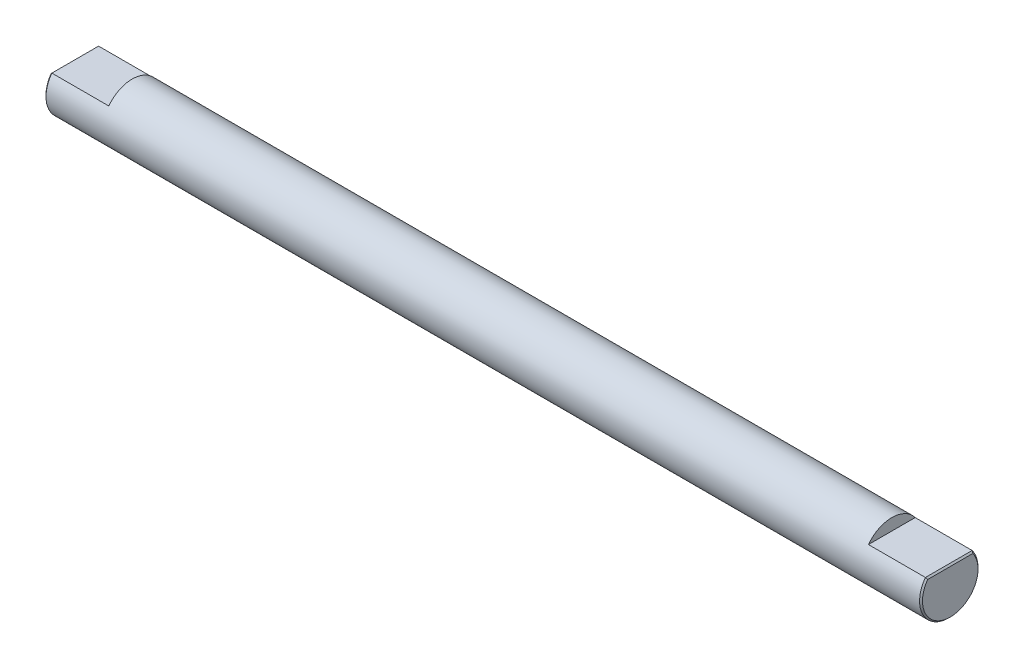
ISO-10303-21;
HEADER;
FILE_DESCRIPTION(('STEP AP214'),'2;1');
FILE_NAME('part.step','',(''),(''),'','','');
FILE_SCHEMA(('AUTOMOTIVE_DESIGN { 1 0 10303 214 1 1 1 1 }'));
ENDSEC;
DATA;
#1=APPLICATION_CONTEXT('core data for automotive mechanical design processes');
#2=APPLICATION_PROTOCOL_DEFINITION('international standard','automotive_design',2000,#1);
#3=PRODUCT_CONTEXT('',#1,'mechanical');
#4=PRODUCT('Part','Part','',(#3));
#5=PRODUCT_RELATED_PRODUCT_CATEGORY('part','',(#4));
#6=PRODUCT_DEFINITION_FORMATION('','',#4);
#7=PRODUCT_DEFINITION_CONTEXT('part definition',#1,'design');
#8=PRODUCT_DEFINITION('design','',#6,#7);
#9=PRODUCT_DEFINITION_SHAPE('','',#8);
#10=(LENGTH_UNIT() NAMED_UNIT(*) SI_UNIT(.MILLI.,.METRE.));
#11=(NAMED_UNIT(*) PLANE_ANGLE_UNIT() SI_UNIT($,.RADIAN.));
#12=(NAMED_UNIT(*) SI_UNIT($,.STERADIAN.) SOLID_ANGLE_UNIT());
#13=UNCERTAINTY_MEASURE_WITH_UNIT(LENGTH_MEASURE(1.E-05),#10,'distance_accuracy_value','');
#14=(GEOMETRIC_REPRESENTATION_CONTEXT(3) GLOBAL_UNCERTAINTY_ASSIGNED_CONTEXT((#13)) GLOBAL_UNIT_ASSIGNED_CONTEXT((#10,
#11,#12)) REPRESENTATION_CONTEXT('',''));
#15=CARTESIAN_POINT('',(0.,0.,0.));
#16=DIRECTION('',(0.,0.,1.));
#17=DIRECTION('',(1.,0.,0.));
#18=AXIS2_PLACEMENT_3D('',#15,#16,#17);
#19=CARTESIAN_POINT('',(0.,0.,0.));
#20=DIRECTION('',(1.,0.,0.));
#21=DIRECTION('',(0.,0.,-1.));
#22=AXIS2_PLACEMENT_3D('',#19,#20,#21);
#23=PLANE('',#22);
#24=CARTESIAN_POINT('',(0.,0.,0.));
#25=DIRECTION('',(1.,0.,0.));
#26=DIRECTION('',(0.,0.,-1.));
#27=AXIS2_PLACEMENT_3D('',#24,#25,#26);
#28=CIRCLE('',#27,9.50000000000001);
#29=CARTESIAN_POINT('',(0.,5.50000000000001,-7.74596669241484));
#30=VERTEX_POINT('',#29);
#31=CARTESIAN_POINT('',(0.,5.50000000000001,7.74596669241484));
#32=VERTEX_POINT('',#31);
#33=EDGE_CURVE('E116',#30,#32,#28,.F.);
#34=ORIENTED_EDGE('',*,*,#33,.T.);
#35=DIRECTION('',(0.,0.,-1.));
#36=VECTOR('',#35,1.);
#37=CARTESIAN_POINT('',(0.,5.50000000000001,0.));
#38=LINE('',#37,#36);
#39=EDGE_CURVE('E124',#32,#30,#38,.T.);
#40=ORIENTED_EDGE('',*,*,#39,.T.);
#41=EDGE_LOOP('',(#34,#40));
#42=FACE_BOUND('',#41,.T.);
#43=ADVANCED_FACE('F35',(#42),#23,.F.);
#44=CARTESIAN_POINT('',(0.,0.,0.));
#45=DIRECTION('',(-1.,0.,0.));
#46=DIRECTION('',(0.,0.,1.));
#47=AXIS2_PLACEMENT_3D('',#44,#45,#46);
#48=CYLINDRICAL_SURFACE('',#47,10.);
#49=DIRECTION('',(-1.,0.,0.));
#50=VECTOR('',#49,1.);
#51=CARTESIAN_POINT('',(0.,6.,8.));
#52=LINE('',#51,#50);
#53=CARTESIAN_POINT('',(20.,6.,7.99999999999999));
#54=VERTEX_POINT('',#53);
#55=CARTESIAN_POINT('',(0.499999999999997,6.,8.));
#56=VERTEX_POINT('',#55);
#57=EDGE_CURVE('E113',#54,#56,#52,.T.);
#58=ORIENTED_EDGE('',*,*,#57,.T.);
#59=CARTESIAN_POINT('',(0.499999999999997,0.,0.));
#60=DIRECTION('',(1.,0.,0.));
#61=DIRECTION('',(0.,0.,-1.));
#62=AXIS2_PLACEMENT_3D('',#59,#60,#61);
#63=CIRCLE('',#62,10.);
#64=CARTESIAN_POINT('',(0.499999999999997,6.,-8.));
#65=VERTEX_POINT('',#64);
#66=EDGE_CURVE('E129',#56,#65,#63,.T.);
#67=ORIENTED_EDGE('',*,*,#66,.T.);
#68=DIRECTION('',(-1.,0.,0.));
#69=VECTOR('',#68,1.);
#70=CARTESIAN_POINT('',(0.,6.,-8.));
#71=LINE('',#70,#69);
#72=CARTESIAN_POINT('',(20.,6.,-8.));
#73=VERTEX_POINT('',#72);
#74=EDGE_CURVE('E163',#65,#73,#71,.F.);
#75=ORIENTED_EDGE('',*,*,#74,.T.);
#76=CARTESIAN_POINT('',(20.,0.,0.));
#77=DIRECTION('',(1.,0.,0.));
#78=DIRECTION('',(0.,0.,-1.));
#79=AXIS2_PLACEMENT_3D('',#76,#77,#78);
#80=CIRCLE('',#79,10.);
#81=EDGE_CURVE('E119',#73,#54,#80,.T.);
#82=ORIENTED_EDGE('',*,*,#81,.T.);
#83=EDGE_LOOP('',(#58,#67,#75,#82));
#84=FACE_BOUND('',#83,.T.);
#85=DIRECTION('',(-1.,0.,0.));
#86=VECTOR('',#85,1.);
#87=CARTESIAN_POINT('',(0.,6.,-8.));
#88=LINE('',#87,#86);
#89=CARTESIAN_POINT('',(280.,6.,-8.));
#90=VERTEX_POINT('',#89);
#91=CARTESIAN_POINT('',(299.5,6.,-8.));
#92=VERTEX_POINT('',#91);
#93=EDGE_CURVE('E96',#90,#92,#88,.F.);
#94=ORIENTED_EDGE('',*,*,#93,.T.);
#95=CARTESIAN_POINT('',(299.5,0.,0.));
#96=DIRECTION('',(-1.,0.,0.));
#97=DIRECTION('',(0.,0.,1.));
#98=AXIS2_PLACEMENT_3D('',#95,#96,#97);
#99=CIRCLE('',#98,10.);
#100=CARTESIAN_POINT('',(299.5,6.,8.));
#101=VERTEX_POINT('',#100);
#102=EDGE_CURVE('E127',#92,#101,#99,.T.);
#103=ORIENTED_EDGE('',*,*,#102,.T.);
#104=DIRECTION('',(-1.,0.,0.));
#105=VECTOR('',#104,1.);
#106=CARTESIAN_POINT('',(0.,6.,8.));
#107=LINE('',#106,#105);
#108=CARTESIAN_POINT('',(280.,6.,7.99999999999999));
#109=VERTEX_POINT('',#108);
#110=EDGE_CURVE('E103',#101,#109,#107,.T.);
#111=ORIENTED_EDGE('',*,*,#110,.T.);
#112=CARTESIAN_POINT('',(280.,0.,0.));
#113=DIRECTION('',(-1.,0.,0.));
#114=DIRECTION('',(0.,0.,1.));
#115=AXIS2_PLACEMENT_3D('',#112,#113,#114);
#116=CIRCLE('',#115,10.);
#117=EDGE_CURVE('E108',#109,#90,#116,.T.);
#118=ORIENTED_EDGE('',*,*,#117,.T.);
#119=EDGE_LOOP('',(#94,#103,#111,#118));
#120=FACE_BOUND('',#119,.T.);
#121=ADVANCED_FACE('F111',(#84,#120),#48,.T.);
#122=CARTESIAN_POINT('',(300.,0.,0.));
#123=DIRECTION('',(-1.,0.,0.));
#124=DIRECTION('',(0.,0.,1.));
#125=AXIS2_PLACEMENT_3D('',#122,#123,#124);
#126=PLANE('',#125);
#127=CARTESIAN_POINT('',(300.,0.,0.));
#128=DIRECTION('',(-1.,0.,0.));
#129=DIRECTION('',(0.,0.,1.));
#130=AXIS2_PLACEMENT_3D('',#127,#128,#129);
#131=CIRCLE('',#130,9.50000000000004);
#132=CARTESIAN_POINT('',(300.,5.50000000000004,7.74596669241485));
#133=VERTEX_POINT('',#132);
#134=CARTESIAN_POINT('',(300.,5.50000000000004,-7.74596669241485));
#135=VERTEX_POINT('',#134);
#136=EDGE_CURVE('E55',#133,#135,#131,.F.);
#137=ORIENTED_EDGE('',*,*,#136,.T.);
#138=DIRECTION('',(0.,0.,1.));
#139=VECTOR('',#138,1.);
#140=CARTESIAN_POINT('',(300.,5.50000000000004,0.));
#141=LINE('',#140,#139);
#142=EDGE_CURVE('E48',#135,#133,#141,.T.);
#143=ORIENTED_EDGE('',*,*,#142,.T.);
#144=EDGE_LOOP('',(#137,#143));
#145=FACE_BOUND('',#144,.T.);
#146=ADVANCED_FACE('F177',(#145),#126,.F.);
#147=CARTESIAN_POINT('',(20.,10.,-10.));
#148=DIRECTION('',(1.,0.,0.));
#149=DIRECTION('',(0.,0.,-1.));
#150=AXIS2_PLACEMENT_3D('',#147,#148,#149);
#151=PLANE('',#150);
#152=DIRECTION('',(0.,0.,1.));
#153=VECTOR('',#152,1.);
#154=CARTESIAN_POINT('',(20.,6.,-10.));
#155=LINE('',#154,#153);
#156=EDGE_CURVE('E160',#73,#54,#155,.T.);
#157=ORIENTED_EDGE('',*,*,#156,.T.);
#158=ORIENTED_EDGE('',*,*,#81,.F.);
#159=EDGE_LOOP('',(#157,#158));
#160=FACE_BOUND('',#159,.T.);
#161=ADVANCED_FACE('F175',(#160),#151,.F.);
#162=CARTESIAN_POINT('',(0.,6.,-10.));
#163=DIRECTION('',(0.,-1.,0.));
#164=DIRECTION('',(0.,0.,-1.));
#165=AXIS2_PLACEMENT_3D('',#162,#163,#164);
#166=PLANE('',#165);
#167=ORIENTED_EDGE('',*,*,#74,.F.);
#168=DIRECTION('',(0.,0.,1.));
#169=VECTOR('',#168,1.);
#170=CARTESIAN_POINT('',(0.499999999999997,6.,-10.));
#171=LINE('',#170,#169);
#172=EDGE_CURVE('E112',#65,#56,#171,.T.);
#173=ORIENTED_EDGE('',*,*,#172,.T.);
#174=ORIENTED_EDGE('',*,*,#57,.F.);
#175=ORIENTED_EDGE('',*,*,#156,.F.);
#176=EDGE_LOOP('',(#167,#173,#174,#175));
#177=FACE_BOUND('',#176,.T.);
#178=ADVANCED_FACE('F173',(#177),#166,.F.);
#179=CARTESIAN_POINT('',(280.,10.,-10.));
#180=DIRECTION('',(-1.,0.,0.));
#181=DIRECTION('',(0.,0.,1.));
#182=AXIS2_PLACEMENT_3D('',#179,#180,#181);
#183=PLANE('',#182);
#184=DIRECTION('',(0.,0.,1.));
#185=VECTOR('',#184,1.);
#186=CARTESIAN_POINT('',(280.,6.,-10.));
#187=LINE('',#186,#185);
#188=EDGE_CURVE('E100',#90,#109,#187,.T.);
#189=ORIENTED_EDGE('',*,*,#188,.F.);
#190=ORIENTED_EDGE('',*,*,#117,.F.);
#191=EDGE_LOOP('',(#189,#190));
#192=FACE_BOUND('',#191,.T.);
#193=ADVANCED_FACE('F107',(#192),#183,.F.);
#194=CARTESIAN_POINT('',(280.,6.,-10.));
#195=DIRECTION('',(0.,-1.,0.));
#196=DIRECTION('',(0.,0.,-1.));
#197=AXIS2_PLACEMENT_3D('',#194,#195,#196);
#198=PLANE('',#197);
#199=ORIENTED_EDGE('',*,*,#110,.F.);
#200=DIRECTION('',(0.,0.,-1.));
#201=VECTOR('',#200,1.);
#202=CARTESIAN_POINT('',(299.5,6.,-10.));
#203=LINE('',#202,#201);
#204=EDGE_CURVE('E11',#101,#92,#203,.T.);
#205=ORIENTED_EDGE('',*,*,#204,.T.);
#206=ORIENTED_EDGE('',*,*,#93,.F.);
#207=ORIENTED_EDGE('',*,*,#188,.T.);
#208=EDGE_LOOP('',(#199,#205,#206,#207));
#209=FACE_BOUND('',#208,.T.);
#210=ADVANCED_FACE('F99',(#209),#198,.F.);
#211=CARTESIAN_POINT('',(0.,0.,0.));
#212=DIRECTION('',(1.,0.,0.));
#213=DIRECTION('',(0.,0.,-1.));
#214=AXIS2_PLACEMENT_3D('',#211,#212,#213);
#215=CONICAL_SURFACE('',#214,9.50000000000001,0.785398163397441);
#216=CARTESIAN_POINT('',(0.499999999999997,6.,8.));
#217=CARTESIAN_POINT('',(0.416513003381054,5.91651300338106,7.95826607221496));
#218=CARTESIAN_POINT('',(0.333102845430587,5.83310284543059,7.91622966965088));
#219=CARTESIAN_POINT('',(0.166436178712001,5.66643617871201,7.83155190066021));
#220=CARTESIAN_POINT('',(0.083179669995801,5.58317966999581,7.78891053402924));
#221=CARTESIAN_POINT('',(0.,5.50000000000001,7.74596669241484));
#222=B_SPLINE_CURVE_WITH_KNOTS('',3,(#216,#217,#218,#219,#220,#221),.UNSPECIFIED.,.F.,.F.,(4,2,
4),(0.,0.37567820319065,0.751356533306189),.UNSPECIFIED.);
#223=EDGE_CURVE('E133',#32,#56,#222,.F.);
#224=ORIENTED_EDGE('',*,*,#223,.F.);
#225=ORIENTED_EDGE('',*,*,#33,.F.);
#226=CARTESIAN_POINT('',(0.,5.50000000000001,-7.74596669241484));
#227=CARTESIAN_POINT('',(0.083179669995802,5.58317966999581,-7.78891053402924));
#228=CARTESIAN_POINT('',(0.166436178712001,5.66643617871201,-7.83155190066021));
#229=CARTESIAN_POINT('',(0.333102845430587,5.83310284543059,-7.91622966965088));
#230=CARTESIAN_POINT('',(0.416513003381053,5.91651300338106,-7.95826607221496));
#231=CARTESIAN_POINT('',(0.499999999999995,6.,-8.00000000000001));
#232=B_SPLINE_CURVE_WITH_KNOTS('',3,(#226,#227,#228,#229,#230,#231),.UNSPECIFIED.,.F.,.F.,(4,2,
4),(0.,0.375678330115539,0.75135653330619),.UNSPECIFIED.);
#233=EDGE_CURVE('E109',#65,#30,#232,.F.);
#234=ORIENTED_EDGE('',*,*,#233,.F.);
#235=ORIENTED_EDGE('',*,*,#66,.F.);
#236=EDGE_LOOP('',(#224,#225,#234,#235));
#237=FACE_BOUND('',#236,.T.);
#238=ADVANCED_FACE('F143',(#237),#215,.T.);
#239=CARTESIAN_POINT('',(0.499999999999997,6.,-10.));
#240=DIRECTION('',(0.707106781186543,-0.707106781186552,0.));
#241=DIRECTION('',(0.,0.,1.));
#242=AXIS2_PLACEMENT_3D('',#239,#240,#241);
#243=PLANE('',#242);
#244=ORIENTED_EDGE('',*,*,#233,.T.);
#245=ORIENTED_EDGE('',*,*,#39,.F.);
#246=ORIENTED_EDGE('',*,*,#223,.T.);
#247=ORIENTED_EDGE('',*,*,#172,.F.);
#248=EDGE_LOOP('',(#244,#245,#246,#247));
#249=FACE_BOUND('',#248,.T.);
#250=ADVANCED_FACE('F146',(#249),#243,.F.);
#251=CARTESIAN_POINT('',(299.5,0.,0.));
#252=DIRECTION('',(-1.,0.,0.));
#253=DIRECTION('',(0.,0.,1.));
#254=AXIS2_PLACEMENT_3D('',#251,#252,#253);
#255=CONICAL_SURFACE('',#254,10.,0.78539816339741);
#256=CARTESIAN_POINT('',(300.,5.50000000000004,7.74596669241485));
#257=CARTESIAN_POINT('',(299.916820330004,5.58317966999583,7.78891053402925));
#258=CARTESIAN_POINT('',(299.833563821288,5.66643617871203,7.83155190066022));
#259=CARTESIAN_POINT('',(299.666897154569,5.8331028454306,7.91622966965089));
#260=CARTESIAN_POINT('',(299.583486996619,5.91651300338106,7.95826607221497));
#261=CARTESIAN_POINT('',(299.5,5.99999999999999,8.00000000000001));
#262=B_SPLINE_CURVE_WITH_KNOTS('',3,(#256,#257,#258,#259,#260,#261),.UNSPECIFIED.,.F.,.F.,(4,2,
4),(0.,0.375678330115562,0.751356533306168),.UNSPECIFIED.);
#263=EDGE_CURVE('E63',#101,#133,#262,.F.);
#264=ORIENTED_EDGE('',*,*,#263,.F.);
#265=ORIENTED_EDGE('',*,*,#102,.F.);
#266=CARTESIAN_POINT('',(299.5,6.,-8.));
#267=CARTESIAN_POINT('',(299.583486996619,5.91651300338106,-7.95826607221496));
#268=CARTESIAN_POINT('',(299.666897154569,5.83310284543061,-7.91622966965088));
#269=CARTESIAN_POINT('',(299.833563821288,5.66643617871203,-7.83155190066022));
#270=CARTESIAN_POINT('',(299.916820330004,5.58317966999584,-7.78891053402926));
#271=CARTESIAN_POINT('',(300.,5.50000000000004,-7.74596669241486));
#272=B_SPLINE_CURVE_WITH_KNOTS('',3,(#266,#267,#268,#269,#270,#271),.UNSPECIFIED.,.F.,.F.,(4,2,
4),(0.,0.375678203190606,0.751356533306163),.UNSPECIFIED.);
#273=EDGE_CURVE('E40',#135,#92,#272,.F.);
#274=ORIENTED_EDGE('',*,*,#273,.F.);
#275=ORIENTED_EDGE('',*,*,#136,.F.);
#276=EDGE_LOOP('',(#264,#265,#274,#275));
#277=FACE_BOUND('',#276,.T.);
#278=ADVANCED_FACE('F149',(#277),#255,.T.);
#279=CARTESIAN_POINT('',(300.,5.50000000000004,0.));
#280=DIRECTION('',(-0.70710678118652,-0.707106781186574,0.));
#281=DIRECTION('',(0.,0.,1.));
#282=AXIS2_PLACEMENT_3D('',#279,#280,#281);
#283=PLANE('',#282);
#284=ORIENTED_EDGE('',*,*,#273,.T.);
#285=ORIENTED_EDGE('',*,*,#204,.F.);
#286=ORIENTED_EDGE('',*,*,#263,.T.);
#287=ORIENTED_EDGE('',*,*,#142,.F.);
#288=EDGE_LOOP('',(#284,#285,#286,#287));
#289=FACE_BOUND('',#288,.T.);
#290=ADVANCED_FACE('F37',(#289),#283,.F.);
#291=CLOSED_SHELL('',(#43,#121,#146,#161,#178,#193,#210,#238,#250,#278,#290));
#292=MANIFOLD_SOLID_BREP('B2',#291);
#293=ADVANCED_BREP_SHAPE_REPRESENTATION('',(#18,#292),#14);
#294=SHAPE_DEFINITION_REPRESENTATION(#9,#293);
ENDSEC;
END-ISO-10303-21;
